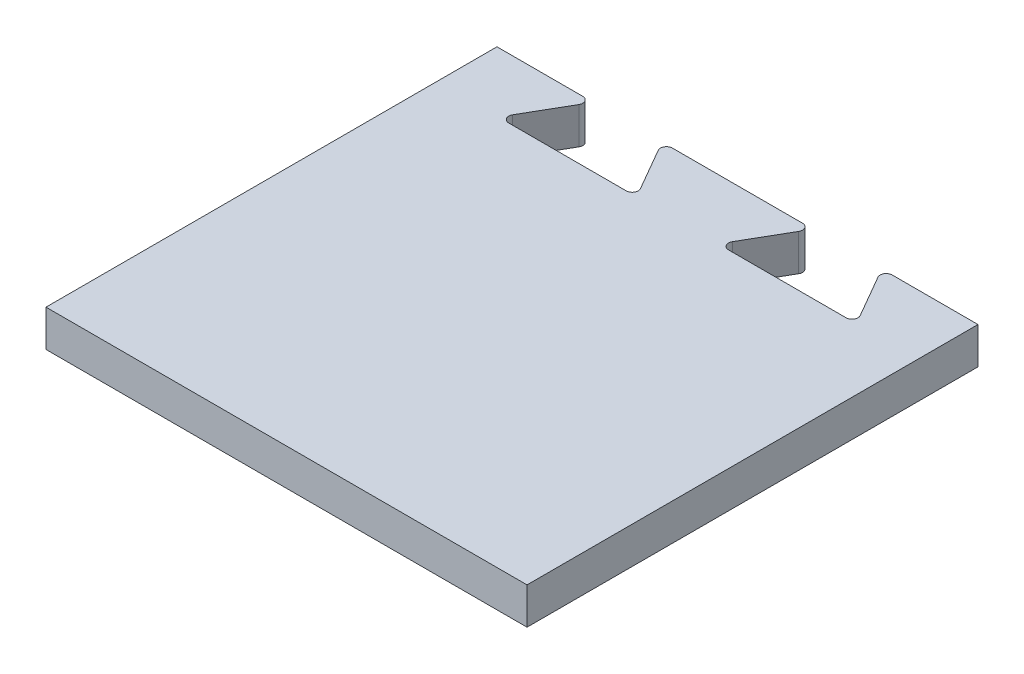
ISO-10303-21;
HEADER;
FILE_DESCRIPTION(('STEP AP214'),'2;1');
FILE_NAME('part.step','',(''),(''),'','','');
FILE_SCHEMA(('AUTOMOTIVE_DESIGN { 1 0 10303 214 1 1 1 1 }'));
ENDSEC;
DATA;
#1=APPLICATION_CONTEXT('core data for automotive mechanical design processes');
#2=APPLICATION_PROTOCOL_DEFINITION('international standard','automotive_design',2000,#1);
#3=PRODUCT_CONTEXT('',#1,'mechanical');
#4=PRODUCT('Part','Part','',(#3));
#5=PRODUCT_RELATED_PRODUCT_CATEGORY('part','',(#4));
#6=PRODUCT_DEFINITION_FORMATION('','',#4);
#7=PRODUCT_DEFINITION_CONTEXT('part definition',#1,'design');
#8=PRODUCT_DEFINITION('design','',#6,#7);
#9=PRODUCT_DEFINITION_SHAPE('','',#8);
#10=(LENGTH_UNIT() NAMED_UNIT(*) SI_UNIT(.MILLI.,.METRE.));
#11=(NAMED_UNIT(*) PLANE_ANGLE_UNIT() SI_UNIT($,.RADIAN.));
#12=(NAMED_UNIT(*) SI_UNIT($,.STERADIAN.) SOLID_ANGLE_UNIT());
#13=UNCERTAINTY_MEASURE_WITH_UNIT(LENGTH_MEASURE(1.E-05),#10,'distance_accuracy_value','');
#14=(GEOMETRIC_REPRESENTATION_CONTEXT(3) GLOBAL_UNCERTAINTY_ASSIGNED_CONTEXT((#13)) GLOBAL_UNIT_ASSIGNED_CONTEXT((#10,
#11,#12)) REPRESENTATION_CONTEXT('',''));
#15=CARTESIAN_POINT('',(0.,0.,0.));
#16=DIRECTION('',(0.,0.,1.));
#17=DIRECTION('',(1.,0.,0.));
#18=AXIS2_PLACEMENT_3D('',#15,#16,#17);
#19=CARTESIAN_POINT('',(40.,3.05,0.));
#20=DIRECTION('',(0.,0.,-1.));
#21=DIRECTION('',(-1.,0.,0.));
#22=AXIS2_PLACEMENT_3D('',#19,#20,#21);
#23=PLANE('',#22);
#24=DIRECTION('',(1.,0.,0.));
#25=VECTOR('',#24,1.);
#26=CARTESIAN_POINT('',(40.,0.,0.));
#27=LINE('',#26,#25);
#28=CARTESIAN_POINT('',(0.,0.,0.));
#29=VERTEX_POINT('',#28);
#30=CARTESIAN_POINT('',(40.,0.,0.));
#31=VERTEX_POINT('',#30);
#32=EDGE_CURVE('E207',#29,#31,#27,.T.);
#33=ORIENTED_EDGE('',*,*,#32,.T.);
#34=DIRECTION('',(0.,-1.,0.));
#35=VECTOR('',#34,1.);
#36=CARTESIAN_POINT('',(40.,3.05,0.));
#37=LINE('',#36,#35);
#38=CARTESIAN_POINT('',(40.,3.05,0.));
#39=VERTEX_POINT('',#38);
#40=EDGE_CURVE('E186',#39,#31,#37,.T.);
#41=ORIENTED_EDGE('',*,*,#40,.F.);
#42=DIRECTION('',(1.,0.,0.));
#43=VECTOR('',#42,1.);
#44=CARTESIAN_POINT('',(40.,3.05,0.));
#45=LINE('',#44,#43);
#46=CARTESIAN_POINT('',(0.,3.05,0.));
#47=VERTEX_POINT('',#46);
#48=EDGE_CURVE('E194',#47,#39,#45,.T.);
#49=ORIENTED_EDGE('',*,*,#48,.F.);
#50=DIRECTION('',(0.,-1.,0.));
#51=VECTOR('',#50,1.);
#52=CARTESIAN_POINT('',(0.,3.05,0.));
#53=LINE('',#52,#51);
#54=EDGE_CURVE('E347',#47,#29,#53,.T.);
#55=ORIENTED_EDGE('',*,*,#54,.T.);
#56=EDGE_LOOP('',(#33,#41,#49,#55));
#57=FACE_BOUND('',#56,.T.);
#58=ADVANCED_FACE('F43',(#57),#23,.F.);
#59=CARTESIAN_POINT('',(40.,3.05,-37.5));
#60=DIRECTION('',(-1.,0.,0.));
#61=DIRECTION('',(0.,0.,1.));
#62=AXIS2_PLACEMENT_3D('',#59,#60,#61);
#63=PLANE('',#62);
#64=DIRECTION('',(0.,0.,-1.));
#65=VECTOR('',#64,1.);
#66=CARTESIAN_POINT('',(40.,0.,-37.5));
#67=LINE('',#66,#65);
#68=CARTESIAN_POINT('',(40.,0.,-37.5));
#69=VERTEX_POINT('',#68);
#70=EDGE_CURVE('E350',#31,#69,#67,.T.);
#71=ORIENTED_EDGE('',*,*,#70,.T.);
#72=DIRECTION('',(0.,-1.,0.));
#73=VECTOR('',#72,1.);
#74=CARTESIAN_POINT('',(40.,3.05,-37.5));
#75=LINE('',#74,#73);
#76=CARTESIAN_POINT('',(40.,3.05,-37.5));
#77=VERTEX_POINT('',#76);
#78=EDGE_CURVE('E189',#77,#69,#75,.T.);
#79=ORIENTED_EDGE('',*,*,#78,.F.);
#80=DIRECTION('',(0.,0.,-1.));
#81=VECTOR('',#80,1.);
#82=CARTESIAN_POINT('',(40.,3.05,-37.5));
#83=LINE('',#82,#81);
#84=EDGE_CURVE('E182',#39,#77,#83,.T.);
#85=ORIENTED_EDGE('',*,*,#84,.F.);
#86=ORIENTED_EDGE('',*,*,#40,.T.);
#87=EDGE_LOOP('',(#71,#79,#85,#86));
#88=FACE_BOUND('',#87,.T.);
#89=ADVANCED_FACE('F184',(#88),#63,.F.);
#90=CARTESIAN_POINT('',(32.,3.05,-37.5));
#91=DIRECTION('',(0.,0.,1.));
#92=DIRECTION('',(1.,0.,0.));
#93=AXIS2_PLACEMENT_3D('',#90,#91,#92);
#94=PLANE('',#93);
#95=DIRECTION('',(-1.,0.,0.));
#96=VECTOR('',#95,1.);
#97=CARTESIAN_POINT('',(32.,0.,-37.5));
#98=LINE('',#97,#96);
#99=CARTESIAN_POINT('',(32.8660254037844,0.,-37.5));
#100=VERTEX_POINT('',#99);
#101=EDGE_CURVE('E353',#69,#100,#98,.T.);
#102=ORIENTED_EDGE('',*,*,#101,.T.);
#103=DIRECTION('',(0.,-1.,0.));
#104=VECTOR('',#103,1.);
#105=CARTESIAN_POINT('',(32.8660254037844,3.05,-37.5));
#106=LINE('',#105,#104);
#107=CARTESIAN_POINT('',(32.8660254037844,3.05,-37.5));
#108=VERTEX_POINT('',#107);
#109=EDGE_CURVE('E241',#100,#108,#106,.F.);
#110=ORIENTED_EDGE('',*,*,#109,.T.);
#111=DIRECTION('',(-1.,0.,0.));
#112=VECTOR('',#111,1.);
#113=CARTESIAN_POINT('',(32.,3.05,-37.5));
#114=LINE('',#113,#112);
#115=EDGE_CURVE('E193',#77,#108,#114,.T.);
#116=ORIENTED_EDGE('',*,*,#115,.F.);
#117=ORIENTED_EDGE('',*,*,#78,.T.);
#118=EDGE_LOOP('',(#102,#110,#116,#117));
#119=FACE_BOUND('',#118,.T.);
#120=ADVANCED_FACE('F394',(#119),#94,.F.);
#121=CARTESIAN_POINT('',(34.8867513459482,3.05,-32.5));
#122=DIRECTION('',(0.866025403784436,0.,-0.500000000000004));
#123=DIRECTION('',(-0.500000000000004,0.,-0.866025403784436));
#124=AXIS2_PLACEMENT_3D('',#121,#122,#123);
#125=PLANE('',#124);
#126=DIRECTION('',(0.500000000000004,0.,0.866025403784436));
#127=VECTOR('',#126,1.);
#128=CARTESIAN_POINT('',(34.8867513459482,0.,-32.5));
#129=LINE('',#128,#127);
#130=CARTESIAN_POINT('',(32.4330127018922,0.,-36.75));
#131=VERTEX_POINT('',#130);
#132=CARTESIAN_POINT('',(34.4537386440559,0.,-33.25));
#133=VERTEX_POINT('',#132);
#134=EDGE_CURVE('E357',#131,#133,#129,.T.);
#135=ORIENTED_EDGE('',*,*,#134,.T.);
#136=DIRECTION('',(0.,-1.,0.));
#137=VECTOR('',#136,1.);
#138=CARTESIAN_POINT('',(34.4537386440559,3.05,-33.25));
#139=LINE('',#138,#137);
#140=CARTESIAN_POINT('',(34.4537386440559,3.05,-33.25));
#141=VERTEX_POINT('',#140);
#142=EDGE_CURVE('E226',#133,#141,#139,.F.);
#143=ORIENTED_EDGE('',*,*,#142,.T.);
#144=DIRECTION('',(0.500000000000004,0.,0.866025403784436));
#145=VECTOR('',#144,1.);
#146=CARTESIAN_POINT('',(34.8867513459482,3.05,-32.5));
#147=LINE('',#146,#145);
#148=CARTESIAN_POINT('',(32.4330127018922,3.05,-36.75));
#149=VERTEX_POINT('',#148);
#150=EDGE_CURVE('E398',#149,#141,#147,.T.);
#151=ORIENTED_EDGE('',*,*,#150,.F.);
#152=DIRECTION('',(0.,-1.,0.));
#153=VECTOR('',#152,1.);
#154=CARTESIAN_POINT('',(32.4330127018922,3.05,-36.75));
#155=LINE('',#154,#153);
#156=EDGE_CURVE('E222',#149,#131,#155,.T.);
#157=ORIENTED_EDGE('',*,*,#156,.T.);
#158=EDGE_LOOP('',(#135,#143,#151,#157));
#159=FACE_BOUND('',#158,.T.);
#160=ADVANCED_FACE('F458',(#159),#125,.F.);
#161=CARTESIAN_POINT('',(23.3867513459482,3.05,-32.5));
#162=DIRECTION('',(0.,0.,1.));
#163=DIRECTION('',(1.,0.,0.));
#164=AXIS2_PLACEMENT_3D('',#161,#162,#163);
#165=PLANE('',#164);
#166=DIRECTION('',(-1.,0.,0.));
#167=VECTOR('',#166,1.);
#168=CARTESIAN_POINT('',(23.3867513459482,3.05,-32.5));
#169=LINE('',#168,#167);
#170=CARTESIAN_POINT('',(34.0207259421637,3.05,-32.5));
#171=VERTEX_POINT('',#170);
#172=CARTESIAN_POINT('',(24.2527767497326,3.05,-32.5));
#173=VERTEX_POINT('',#172);
#174=EDGE_CURVE('E402',#171,#173,#169,.T.);
#175=ORIENTED_EDGE('',*,*,#174,.F.);
#176=DIRECTION('',(0.,-1.,0.));
#177=VECTOR('',#176,1.);
#178=CARTESIAN_POINT('',(34.0207259421637,0.,-32.5));
#179=LINE('',#178,#177);
#180=CARTESIAN_POINT('',(34.0207259421637,0.,-32.5));
#181=VERTEX_POINT('',#180);
#182=EDGE_CURVE('E213',#171,#181,#179,.T.);
#183=ORIENTED_EDGE('',*,*,#182,.T.);
#184=DIRECTION('',(-1.,0.,0.));
#185=VECTOR('',#184,1.);
#186=CARTESIAN_POINT('',(23.3867513459482,0.,-32.5));
#187=LINE('',#186,#185);
#188=CARTESIAN_POINT('',(24.2527767497326,0.,-32.5));
#189=VERTEX_POINT('',#188);
#190=EDGE_CURVE('E361',#181,#189,#187,.T.);
#191=ORIENTED_EDGE('',*,*,#190,.T.);
#192=DIRECTION('',(0.,-1.,0.));
#193=VECTOR('',#192,1.);
#194=CARTESIAN_POINT('',(24.2527767497326,3.05,-32.5));
#195=LINE('',#194,#193);
#196=EDGE_CURVE('E209',#189,#173,#195,.F.);
#197=ORIENTED_EDGE('',*,*,#196,.T.);
#198=EDGE_LOOP('',(#175,#183,#191,#197));
#199=FACE_BOUND('',#198,.T.);
#200=ADVANCED_FACE('F451',(#199),#165,.F.);
#201=CARTESIAN_POINT('',(26.2735026918963,3.05,-37.5));
#202=DIRECTION('',(-0.866025403784437,0.,-0.500000000000003));
#203=DIRECTION('',(-0.500000000000003,0.,0.866025403784437));
#204=AXIS2_PLACEMENT_3D('',#201,#202,#203);
#205=PLANE('',#204);
#206=DIRECTION('',(0.500000000000003,0.,-0.866025403784437));
#207=VECTOR('',#206,1.);
#208=CARTESIAN_POINT('',(26.2735026918963,3.05,-37.5));
#209=LINE('',#208,#207);
#210=CARTESIAN_POINT('',(23.8197640478404,3.05,-33.25));
#211=VERTEX_POINT('',#210);
#212=CARTESIAN_POINT('',(25.8404899900041,3.05,-36.75));
#213=VERTEX_POINT('',#212);
#214=EDGE_CURVE('E408',#211,#213,#209,.T.);
#215=ORIENTED_EDGE('',*,*,#214,.F.);
#216=DIRECTION('',(0.,-1.,0.));
#217=VECTOR('',#216,1.);
#218=CARTESIAN_POINT('',(23.8197640478404,0.,-33.25));
#219=LINE('',#218,#217);
#220=CARTESIAN_POINT('',(23.8197640478404,0.,-33.25));
#221=VERTEX_POINT('',#220);
#222=EDGE_CURVE('E258',#211,#221,#219,.T.);
#223=ORIENTED_EDGE('',*,*,#222,.T.);
#224=DIRECTION('',(0.500000000000003,0.,-0.866025403784437));
#225=VECTOR('',#224,1.);
#226=CARTESIAN_POINT('',(26.2735026918963,0.,-37.5));
#227=LINE('',#226,#225);
#228=CARTESIAN_POINT('',(25.8404899900041,0.,-36.75));
#229=VERTEX_POINT('',#228);
#230=EDGE_CURVE('E365',#221,#229,#227,.T.);
#231=ORIENTED_EDGE('',*,*,#230,.T.);
#232=DIRECTION('',(0.,-1.,0.));
#233=VECTOR('',#232,1.);
#234=CARTESIAN_POINT('',(25.8404899900041,3.05,-36.75));
#235=LINE('',#234,#233);
#236=EDGE_CURVE('E255',#229,#213,#235,.F.);
#237=ORIENTED_EDGE('',*,*,#236,.T.);
#238=EDGE_LOOP('',(#215,#223,#231,#237));
#239=FACE_BOUND('',#238,.T.);
#240=ADVANCED_FACE('F442',(#239),#205,.F.);
#241=CARTESIAN_POINT('',(13.7264973081037,3.05,-37.5));
#242=DIRECTION('',(0.,0.,1.));
#243=DIRECTION('',(1.,0.,0.));
#244=AXIS2_PLACEMENT_3D('',#241,#242,#243);
#245=PLANE('',#244);
#246=DIRECTION('',(-1.,0.,0.));
#247=VECTOR('',#246,1.);
#248=CARTESIAN_POINT('',(13.7264973081037,3.05,-37.5));
#249=LINE('',#248,#247);
#250=CARTESIAN_POINT('',(25.4074772881119,3.05,-37.5));
#251=VERTEX_POINT('',#250);
#252=CARTESIAN_POINT('',(14.5925227118881,3.05,-37.5));
#253=VERTEX_POINT('',#252);
#254=EDGE_CURVE('E412',#251,#253,#249,.T.);
#255=ORIENTED_EDGE('',*,*,#254,.F.);
#256=DIRECTION('',(0.,-1.,0.));
#257=VECTOR('',#256,1.);
#258=CARTESIAN_POINT('',(25.4074772881119,3.05,-37.5));
#259=LINE('',#258,#257);
#260=CARTESIAN_POINT('',(25.4074772881119,0.,-37.5));
#261=VERTEX_POINT('',#260);
#262=EDGE_CURVE('E265',#251,#261,#259,.T.);
#263=ORIENTED_EDGE('',*,*,#262,.T.);
#264=DIRECTION('',(-1.,0.,0.));
#265=VECTOR('',#264,1.);
#266=CARTESIAN_POINT('',(13.7264973081037,0.,-37.5));
#267=LINE('',#266,#265);
#268=CARTESIAN_POINT('',(14.5925227118881,0.,-37.5));
#269=VERTEX_POINT('',#268);
#270=EDGE_CURVE('E369',#261,#269,#267,.T.);
#271=ORIENTED_EDGE('',*,*,#270,.T.);
#272=DIRECTION('',(0.,-1.,0.));
#273=VECTOR('',#272,1.);
#274=CARTESIAN_POINT('',(14.5925227118881,3.05,-37.5));
#275=LINE('',#274,#273);
#276=EDGE_CURVE('E262',#269,#253,#275,.F.);
#277=ORIENTED_EDGE('',*,*,#276,.T.);
#278=EDGE_LOOP('',(#255,#263,#271,#277));
#279=FACE_BOUND('',#278,.T.);
#280=ADVANCED_FACE('F433',(#279),#245,.F.);
#281=CARTESIAN_POINT('',(16.6132486540518,3.05,-32.5));
#282=DIRECTION('',(0.866025403784436,0.,-0.500000000000004));
#283=DIRECTION('',(-0.500000000000004,0.,-0.866025403784436));
#284=AXIS2_PLACEMENT_3D('',#281,#282,#283);
#285=PLANE('',#284);
#286=DIRECTION('',(0.500000000000004,0.,0.866025403784436));
#287=VECTOR('',#286,1.);
#288=CARTESIAN_POINT('',(16.6132486540518,3.05,-32.5));
#289=LINE('',#288,#287);
#290=CARTESIAN_POINT('',(14.1595100099959,3.05,-36.75));
#291=VERTEX_POINT('',#290);
#292=CARTESIAN_POINT('',(16.1802359521596,3.05,-33.25));
#293=VERTEX_POINT('',#292);
#294=EDGE_CURVE('E341',#291,#293,#289,.T.);
#295=ORIENTED_EDGE('',*,*,#294,.F.);
#296=DIRECTION('',(0.,-1.,0.));
#297=VECTOR('',#296,1.);
#298=CARTESIAN_POINT('',(14.1595100099959,3.05,-36.75));
#299=LINE('',#298,#297);
#300=CARTESIAN_POINT('',(14.1595100099959,0.,-36.75));
#301=VERTEX_POINT('',#300);
#302=EDGE_CURVE('E272',#291,#301,#299,.T.);
#303=ORIENTED_EDGE('',*,*,#302,.T.);
#304=DIRECTION('',(0.500000000000004,0.,0.866025403784436));
#305=VECTOR('',#304,1.);
#306=CARTESIAN_POINT('',(16.6132486540518,0.,-32.5));
#307=LINE('',#306,#305);
#308=CARTESIAN_POINT('',(16.1802359521596,0.,-33.25));
#309=VERTEX_POINT('',#308);
#310=EDGE_CURVE('E328',#301,#309,#307,.T.);
#311=ORIENTED_EDGE('',*,*,#310,.T.);
#312=DIRECTION('',(0.,-1.,0.));
#313=VECTOR('',#312,1.);
#314=CARTESIAN_POINT('',(16.1802359521596,3.05,-33.25));
#315=LINE('',#314,#313);
#316=EDGE_CURVE('E269',#309,#293,#315,.F.);
#317=ORIENTED_EDGE('',*,*,#316,.T.);
#318=EDGE_LOOP('',(#295,#303,#311,#317));
#319=FACE_BOUND('',#318,.T.);
#320=ADVANCED_FACE('F426',(#319),#285,.F.);
#321=CARTESIAN_POINT('',(5.11324865405185,3.05,-32.5));
#322=DIRECTION('',(0.,0.,1.));
#323=DIRECTION('',(1.,0.,0.));
#324=AXIS2_PLACEMENT_3D('',#321,#322,#323);
#325=PLANE('',#324);
#326=DIRECTION('',(-1.,0.,0.));
#327=VECTOR('',#326,1.);
#328=CARTESIAN_POINT('',(5.11324865405185,3.05,-32.5));
#329=LINE('',#328,#327);
#330=CARTESIAN_POINT('',(15.7472232502674,3.05,-32.5));
#331=VERTEX_POINT('',#330);
#332=CARTESIAN_POINT('',(5.97927405783629,3.05,-32.5));
#333=VERTEX_POINT('',#332);
#334=EDGE_CURVE('E333',#331,#333,#329,.T.);
#335=ORIENTED_EDGE('',*,*,#334,.F.);
#336=DIRECTION('',(0.,-1.,0.));
#337=VECTOR('',#336,1.);
#338=CARTESIAN_POINT('',(15.7472232502674,0.,-32.5));
#339=LINE('',#338,#337);
#340=CARTESIAN_POINT('',(15.7472232502674,0.,-32.5));
#341=VERTEX_POINT('',#340);
#342=EDGE_CURVE('E279',#331,#341,#339,.T.);
#343=ORIENTED_EDGE('',*,*,#342,.T.);
#344=DIRECTION('',(-1.,0.,0.));
#345=VECTOR('',#344,1.);
#346=CARTESIAN_POINT('',(5.11324865405185,0.,-32.5));
#347=LINE('',#346,#345);
#348=CARTESIAN_POINT('',(5.97927405783629,0.,-32.5));
#349=VERTEX_POINT('',#348);
#350=EDGE_CURVE('E317',#341,#349,#347,.T.);
#351=ORIENTED_EDGE('',*,*,#350,.T.);
#352=DIRECTION('',(0.,-1.,0.));
#353=VECTOR('',#352,1.);
#354=CARTESIAN_POINT('',(5.97927405783629,3.05,-32.5));
#355=LINE('',#354,#353);
#356=EDGE_CURVE('E276',#349,#333,#355,.F.);
#357=ORIENTED_EDGE('',*,*,#356,.T.);
#358=EDGE_LOOP('',(#335,#343,#351,#357));
#359=FACE_BOUND('',#358,.T.);
#360=ADVANCED_FACE('F324',(#359),#325,.F.);
#361=CARTESIAN_POINT('',(8.,3.05,-37.5));
#362=DIRECTION('',(-0.866025403784437,0.,-0.500000000000003));
#363=DIRECTION('',(-0.500000000000003,0.,0.866025403784437));
#364=AXIS2_PLACEMENT_3D('',#361,#362,#363);
#365=PLANE('',#364);
#366=DIRECTION('',(0.500000000000003,0.,-0.866025403784437));
#367=VECTOR('',#366,1.);
#368=CARTESIAN_POINT('',(8.,3.05,-37.5));
#369=LINE('',#368,#367);
#370=CARTESIAN_POINT('',(5.54626135594407,3.05,-33.25));
#371=VERTEX_POINT('',#370);
#372=CARTESIAN_POINT('',(7.56698729810778,3.05,-36.75));
#373=VERTEX_POINT('',#372);
#374=EDGE_CURVE('E332',#371,#373,#369,.T.);
#375=ORIENTED_EDGE('',*,*,#374,.F.);
#376=DIRECTION('',(0.,-1.,0.));
#377=VECTOR('',#376,1.);
#378=CARTESIAN_POINT('',(5.54626135594407,0.,-33.25));
#379=LINE('',#378,#377);
#380=CARTESIAN_POINT('',(5.54626135594407,0.,-33.25));
#381=VERTEX_POINT('',#380);
#382=EDGE_CURVE('E285',#371,#381,#379,.T.);
#383=ORIENTED_EDGE('',*,*,#382,.T.);
#384=DIRECTION('',(0.500000000000003,0.,-0.866025403784437));
#385=VECTOR('',#384,1.);
#386=CARTESIAN_POINT('',(8.,0.,-37.5));
#387=LINE('',#386,#385);
#388=CARTESIAN_POINT('',(7.56698729810778,0.,-36.75));
#389=VERTEX_POINT('',#388);
#390=EDGE_CURVE('E318',#381,#389,#387,.T.);
#391=ORIENTED_EDGE('',*,*,#390,.T.);
#392=DIRECTION('',(0.,-1.,0.));
#393=VECTOR('',#392,1.);
#394=CARTESIAN_POINT('',(7.56698729810778,3.05,-36.75));
#395=LINE('',#394,#393);
#396=EDGE_CURVE('E67',#389,#373,#395,.F.);
#397=ORIENTED_EDGE('',*,*,#396,.T.);
#398=EDGE_LOOP('',(#375,#383,#391,#397));
#399=FACE_BOUND('',#398,.T.);
#400=ADVANCED_FACE('F334',(#399),#365,.F.);
#401=CARTESIAN_POINT('',(0.,3.05,-37.5));
#402=DIRECTION('',(0.,0.,1.));
#403=DIRECTION('',(1.,0.,0.));
#404=AXIS2_PLACEMENT_3D('',#401,#402,#403);
#405=PLANE('',#404);
#406=DIRECTION('',(-1.,0.,0.));
#407=VECTOR('',#406,1.);
#408=CARTESIAN_POINT('',(0.,3.05,-37.5));
#409=LINE('',#408,#407);
#410=CARTESIAN_POINT('',(7.13397459621556,3.05,-37.5));
#411=VERTEX_POINT('',#410);
#412=CARTESIAN_POINT('',(0.,3.05,-37.5));
#413=VERTEX_POINT('',#412);
#414=EDGE_CURVE('E336',#411,#413,#409,.T.);
#415=ORIENTED_EDGE('',*,*,#414,.F.);
#416=DIRECTION('',(0.,-1.,0.));
#417=VECTOR('',#416,1.);
#418=CARTESIAN_POINT('',(7.13397459621556,3.05,-37.5));
#419=LINE('',#418,#417);
#420=CARTESIAN_POINT('',(7.13397459621556,0.,-37.5));
#421=VERTEX_POINT('',#420);
#422=EDGE_CURVE('E289',#411,#421,#419,.T.);
#423=ORIENTED_EDGE('',*,*,#422,.T.);
#424=DIRECTION('',(-1.,0.,0.));
#425=VECTOR('',#424,1.);
#426=CARTESIAN_POINT('',(0.,0.,-37.5));
#427=LINE('',#426,#425);
#428=CARTESIAN_POINT('',(0.,0.,-37.5));
#429=VERTEX_POINT('',#428);
#430=EDGE_CURVE('E378',#421,#429,#427,.T.);
#431=ORIENTED_EDGE('',*,*,#430,.T.);
#432=DIRECTION('',(0.,-1.,0.));
#433=VECTOR('',#432,1.);
#434=CARTESIAN_POINT('',(0.,3.05,-37.5));
#435=LINE('',#434,#433);
#436=EDGE_CURVE('E215',#413,#429,#435,.T.);
#437=ORIENTED_EDGE('',*,*,#436,.F.);
#438=EDGE_LOOP('',(#415,#423,#431,#437));
#439=FACE_BOUND('',#438,.T.);
#440=ADVANCED_FACE('F494',(#439),#405,.F.);
#441=CARTESIAN_POINT('',(0.,3.05,0.));
#442=DIRECTION('',(1.,0.,0.));
#443=DIRECTION('',(0.,0.,-1.));
#444=AXIS2_PLACEMENT_3D('',#441,#442,#443);
#445=PLANE('',#444);
#446=DIRECTION('',(0.,0.,1.));
#447=VECTOR('',#446,1.);
#448=CARTESIAN_POINT('',(0.,0.,0.));
#449=LINE('',#448,#447);
#450=EDGE_CURVE('E204',#429,#29,#449,.T.);
#451=ORIENTED_EDGE('',*,*,#450,.T.);
#452=ORIENTED_EDGE('',*,*,#54,.F.);
#453=DIRECTION('',(0.,0.,1.));
#454=VECTOR('',#453,1.);
#455=CARTESIAN_POINT('',(0.,3.05,0.));
#456=LINE('',#455,#454);
#457=EDGE_CURVE('E199',#413,#47,#456,.T.);
#458=ORIENTED_EDGE('',*,*,#457,.F.);
#459=ORIENTED_EDGE('',*,*,#436,.T.);
#460=EDGE_LOOP('',(#451,#452,#458,#459));
#461=FACE_BOUND('',#460,.T.);
#462=ADVANCED_FACE('F389',(#461),#445,.F.);
#463=CARTESIAN_POINT('',(0.,3.05,0.));
#464=DIRECTION('',(0.,-1.,0.));
#465=DIRECTION('',(0.,0.,-1.));
#466=AXIS2_PLACEMENT_3D('',#463,#464,#465);
#467=PLANE('',#466);
#468=ORIENTED_EDGE('',*,*,#115,.T.);
#469=CARTESIAN_POINT('',(32.8660254037844,3.05,-37.));
#470=DIRECTION('',(0.,-1.,0.));
#471=DIRECTION('',(0.,0.,-1.));
#472=AXIS2_PLACEMENT_3D('',#469,#470,#471);
#473=CIRCLE('',#472,0.5);
#474=EDGE_CURVE('E252',#108,#149,#473,.F.);
#475=ORIENTED_EDGE('',*,*,#474,.T.);
#476=ORIENTED_EDGE('',*,*,#150,.T.);
#477=CARTESIAN_POINT('',(34.0207259421637,3.05,-33.));
#478=DIRECTION('',(0.,-1.,0.));
#479=DIRECTION('',(0.,0.,-1.));
#480=AXIS2_PLACEMENT_3D('',#477,#478,#479);
#481=CIRCLE('',#480,0.5);
#482=EDGE_CURVE('E296',#141,#171,#481,.T.);
#483=ORIENTED_EDGE('',*,*,#482,.T.);
#484=ORIENTED_EDGE('',*,*,#174,.T.);
#485=CARTESIAN_POINT('',(24.2527767497326,3.05,-33.));
#486=DIRECTION('',(0.,-1.,0.));
#487=DIRECTION('',(0.,0.,-1.));
#488=AXIS2_PLACEMENT_3D('',#485,#486,#487);
#489=CIRCLE('',#488,0.5);
#490=EDGE_CURVE('E302',#173,#211,#489,.T.);
#491=ORIENTED_EDGE('',*,*,#490,.T.);
#492=ORIENTED_EDGE('',*,*,#214,.T.);
#493=CARTESIAN_POINT('',(25.4074772881119,3.05,-37.));
#494=DIRECTION('',(0.,-1.,0.));
#495=DIRECTION('',(0.,0.,-1.));
#496=AXIS2_PLACEMENT_3D('',#493,#494,#495);
#497=CIRCLE('',#496,0.5);
#498=EDGE_CURVE('E249',#213,#251,#497,.F.);
#499=ORIENTED_EDGE('',*,*,#498,.T.);
#500=ORIENTED_EDGE('',*,*,#254,.T.);
#501=CARTESIAN_POINT('',(14.5925227118881,3.05,-37.));
#502=DIRECTION('',(0.,-1.,0.));
#503=DIRECTION('',(0.,0.,-1.));
#504=AXIS2_PLACEMENT_3D('',#501,#502,#503);
#505=CIRCLE('',#504,0.5);
#506=EDGE_CURVE('E246',#253,#291,#505,.F.);
#507=ORIENTED_EDGE('',*,*,#506,.T.);
#508=ORIENTED_EDGE('',*,*,#294,.T.);
#509=CARTESIAN_POINT('',(15.7472232502674,3.05,-33.));
#510=DIRECTION('',(0.,-1.,0.));
#511=DIRECTION('',(0.,0.,-1.));
#512=AXIS2_PLACEMENT_3D('',#509,#510,#511);
#513=CIRCLE('',#512,0.5);
#514=EDGE_CURVE('E308',#293,#331,#513,.T.);
#515=ORIENTED_EDGE('',*,*,#514,.T.);
#516=ORIENTED_EDGE('',*,*,#334,.T.);
#517=CARTESIAN_POINT('',(5.97927405783629,3.05,-33.));
#518=DIRECTION('',(0.,-1.,0.));
#519=DIRECTION('',(0.,0.,-1.));
#520=AXIS2_PLACEMENT_3D('',#517,#518,#519);
#521=CIRCLE('',#520,0.5);
#522=EDGE_CURVE('E11',#333,#371,#521,.T.);
#523=ORIENTED_EDGE('',*,*,#522,.T.);
#524=ORIENTED_EDGE('',*,*,#374,.T.);
#525=CARTESIAN_POINT('',(7.13397459621556,3.05,-37.));
#526=DIRECTION('',(0.,-1.,0.));
#527=DIRECTION('',(0.,0.,-1.));
#528=AXIS2_PLACEMENT_3D('',#525,#526,#527);
#529=CIRCLE('',#528,0.5);
#530=EDGE_CURVE('E59',#373,#411,#529,.F.);
#531=ORIENTED_EDGE('',*,*,#530,.T.);
#532=ORIENTED_EDGE('',*,*,#414,.T.);
#533=ORIENTED_EDGE('',*,*,#457,.T.);
#534=ORIENTED_EDGE('',*,*,#48,.T.);
#535=ORIENTED_EDGE('',*,*,#84,.T.);
#536=EDGE_LOOP('',(#468,#475,#476,#483,#484,#491,#492,#499,#500,#507,#508,#515,#516,#523,#524,
#531,#532,#533,#534,#535));
#537=FACE_BOUND('',#536,.T.);
#538=ADVANCED_FACE('F197',(#537),#467,.F.);
#539=CARTESIAN_POINT('',(0.,0.,0.));
#540=DIRECTION('',(0.,-1.,0.));
#541=DIRECTION('',(0.,0.,-1.));
#542=AXIS2_PLACEMENT_3D('',#539,#540,#541);
#543=PLANE('',#542);
#544=ORIENTED_EDGE('',*,*,#134,.F.);
#545=CARTESIAN_POINT('',(32.8660254037844,0.,-37.));
#546=DIRECTION('',(0.,-1.,0.));
#547=DIRECTION('',(0.,0.,-1.));
#548=AXIS2_PLACEMENT_3D('',#545,#546,#547);
#549=CIRCLE('',#548,0.5);
#550=EDGE_CURVE('E238',#131,#100,#549,.T.);
#551=ORIENTED_EDGE('',*,*,#550,.T.);
#552=ORIENTED_EDGE('',*,*,#101,.F.);
#553=ORIENTED_EDGE('',*,*,#70,.F.);
#554=ORIENTED_EDGE('',*,*,#32,.F.);
#555=ORIENTED_EDGE('',*,*,#450,.F.);
#556=ORIENTED_EDGE('',*,*,#430,.F.);
#557=CARTESIAN_POINT('',(7.13397459621556,0.,-37.));
#558=DIRECTION('',(0.,-1.,0.));
#559=DIRECTION('',(0.,0.,-1.));
#560=AXIS2_PLACEMENT_3D('',#557,#558,#559);
#561=CIRCLE('',#560,0.5);
#562=EDGE_CURVE('E229',#421,#389,#561,.T.);
#563=ORIENTED_EDGE('',*,*,#562,.T.);
#564=ORIENTED_EDGE('',*,*,#390,.F.);
#565=CARTESIAN_POINT('',(5.97927405783629,0.,-33.));
#566=DIRECTION('',(0.,-1.,0.));
#567=DIRECTION('',(0.,0.,-1.));
#568=AXIS2_PLACEMENT_3D('',#565,#566,#567);
#569=CIRCLE('',#568,0.5);
#570=EDGE_CURVE('E52',#381,#349,#569,.F.);
#571=ORIENTED_EDGE('',*,*,#570,.T.);
#572=ORIENTED_EDGE('',*,*,#350,.F.);
#573=CARTESIAN_POINT('',(15.7472232502674,0.,-33.));
#574=DIRECTION('',(0.,-1.,0.));
#575=DIRECTION('',(0.,0.,-1.));
#576=AXIS2_PLACEMENT_3D('',#573,#574,#575);
#577=CIRCLE('',#576,0.5);
#578=EDGE_CURVE('E305',#341,#309,#577,.F.);
#579=ORIENTED_EDGE('',*,*,#578,.T.);
#580=ORIENTED_EDGE('',*,*,#310,.F.);
#581=CARTESIAN_POINT('',(14.5925227118881,0.,-37.));
#582=DIRECTION('',(0.,-1.,0.));
#583=DIRECTION('',(0.,0.,-1.));
#584=AXIS2_PLACEMENT_3D('',#581,#582,#583);
#585=CIRCLE('',#584,0.5);
#586=EDGE_CURVE('E232',#301,#269,#585,.T.);
#587=ORIENTED_EDGE('',*,*,#586,.T.);
#588=ORIENTED_EDGE('',*,*,#270,.F.);
#589=CARTESIAN_POINT('',(25.4074772881119,0.,-37.));
#590=DIRECTION('',(0.,-1.,0.));
#591=DIRECTION('',(0.,0.,-1.));
#592=AXIS2_PLACEMENT_3D('',#589,#590,#591);
#593=CIRCLE('',#592,0.5);
#594=EDGE_CURVE('E235',#261,#229,#593,.T.);
#595=ORIENTED_EDGE('',*,*,#594,.T.);
#596=ORIENTED_EDGE('',*,*,#230,.F.);
#597=CARTESIAN_POINT('',(24.2527767497326,0.,-33.));
#598=DIRECTION('',(0.,-1.,0.));
#599=DIRECTION('',(0.,0.,-1.));
#600=AXIS2_PLACEMENT_3D('',#597,#598,#599);
#601=CIRCLE('',#600,0.5);
#602=EDGE_CURVE('E299',#221,#189,#601,.F.);
#603=ORIENTED_EDGE('',*,*,#602,.T.);
#604=ORIENTED_EDGE('',*,*,#190,.F.);
#605=CARTESIAN_POINT('',(34.0207259421637,0.,-33.));
#606=DIRECTION('',(0.,-1.,0.));
#607=DIRECTION('',(0.,0.,-1.));
#608=AXIS2_PLACEMENT_3D('',#605,#606,#607);
#609=CIRCLE('',#608,0.5);
#610=EDGE_CURVE('E293',#181,#133,#609,.F.);
#611=ORIENTED_EDGE('',*,*,#610,.T.);
#612=EDGE_LOOP('',(#544,#551,#552,#553,#554,#555,#556,#563,#564,#571,#572,#579,#580,#587,#588,
#595,#596,#603,#604,#611));
#613=FACE_BOUND('',#612,.T.);
#614=ADVANCED_FACE('F316',(#613),#543,.T.);
#615=CARTESIAN_POINT('',(34.0207259421637,3.05,-33.));
#616=DIRECTION('',(0.,1.,0.));
#617=DIRECTION('',(0.,0.,1.));
#618=AXIS2_PLACEMENT_3D('',#615,#616,#617);
#619=CYLINDRICAL_SURFACE('',#618,0.5);
#620=ORIENTED_EDGE('',*,*,#482,.F.);
#621=ORIENTED_EDGE('',*,*,#142,.F.);
#622=ORIENTED_EDGE('',*,*,#610,.F.);
#623=ORIENTED_EDGE('',*,*,#182,.F.);
#624=EDGE_LOOP('',(#620,#621,#622,#623));
#625=FACE_BOUND('',#624,.T.);
#626=ADVANCED_FACE('F455',(#625),#619,.F.);
#627=CARTESIAN_POINT('',(32.8660254037844,3.05,-37.));
#628=DIRECTION('',(0.,-1.,0.));
#629=DIRECTION('',(0.,0.,-1.));
#630=AXIS2_PLACEMENT_3D('',#627,#628,#629);
#631=CYLINDRICAL_SURFACE('',#630,0.5);
#632=ORIENTED_EDGE('',*,*,#474,.F.);
#633=ORIENTED_EDGE('',*,*,#109,.F.);
#634=ORIENTED_EDGE('',*,*,#550,.F.);
#635=ORIENTED_EDGE('',*,*,#156,.F.);
#636=EDGE_LOOP('',(#632,#633,#634,#635));
#637=FACE_BOUND('',#636,.T.);
#638=ADVANCED_FACE('F462',(#637),#631,.T.);
#639=CARTESIAN_POINT('',(24.2527767497326,3.05,-33.));
#640=DIRECTION('',(0.,1.,0.));
#641=DIRECTION('',(0.,0.,1.));
#642=AXIS2_PLACEMENT_3D('',#639,#640,#641);
#643=CYLINDRICAL_SURFACE('',#642,0.5);
#644=ORIENTED_EDGE('',*,*,#490,.F.);
#645=ORIENTED_EDGE('',*,*,#196,.F.);
#646=ORIENTED_EDGE('',*,*,#602,.F.);
#647=ORIENTED_EDGE('',*,*,#222,.F.);
#648=EDGE_LOOP('',(#644,#645,#646,#647));
#649=FACE_BOUND('',#648,.T.);
#650=ADVANCED_FACE('F446',(#649),#643,.F.);
#651=CARTESIAN_POINT('',(25.4074772881119,3.05,-37.));
#652=DIRECTION('',(0.,-1.,0.));
#653=DIRECTION('',(0.,0.,-1.));
#654=AXIS2_PLACEMENT_3D('',#651,#652,#653);
#655=CYLINDRICAL_SURFACE('',#654,0.5);
#656=ORIENTED_EDGE('',*,*,#498,.F.);
#657=ORIENTED_EDGE('',*,*,#236,.F.);
#658=ORIENTED_EDGE('',*,*,#594,.F.);
#659=ORIENTED_EDGE('',*,*,#262,.F.);
#660=EDGE_LOOP('',(#656,#657,#658,#659));
#661=FACE_BOUND('',#660,.T.);
#662=ADVANCED_FACE('F437',(#661),#655,.T.);
#663=CARTESIAN_POINT('',(14.5925227118881,3.05,-37.));
#664=DIRECTION('',(0.,-1.,0.));
#665=DIRECTION('',(0.,0.,-1.));
#666=AXIS2_PLACEMENT_3D('',#663,#664,#665);
#667=CYLINDRICAL_SURFACE('',#666,0.5);
#668=ORIENTED_EDGE('',*,*,#506,.F.);
#669=ORIENTED_EDGE('',*,*,#276,.F.);
#670=ORIENTED_EDGE('',*,*,#586,.F.);
#671=ORIENTED_EDGE('',*,*,#302,.F.);
#672=EDGE_LOOP('',(#668,#669,#670,#671));
#673=FACE_BOUND('',#672,.T.);
#674=ADVANCED_FACE('F428',(#673),#667,.T.);
#675=CARTESIAN_POINT('',(15.7472232502674,3.05,-33.));
#676=DIRECTION('',(0.,1.,0.));
#677=DIRECTION('',(0.,0.,1.));
#678=AXIS2_PLACEMENT_3D('',#675,#676,#677);
#679=CYLINDRICAL_SURFACE('',#678,0.5);
#680=ORIENTED_EDGE('',*,*,#514,.F.);
#681=ORIENTED_EDGE('',*,*,#316,.F.);
#682=ORIENTED_EDGE('',*,*,#578,.F.);
#683=ORIENTED_EDGE('',*,*,#342,.F.);
#684=EDGE_LOOP('',(#680,#681,#682,#683));
#685=FACE_BOUND('',#684,.T.);
#686=ADVANCED_FACE('F424',(#685),#679,.F.);
#687=CARTESIAN_POINT('',(5.97927405783629,3.05,-33.));
#688=DIRECTION('',(0.,1.,0.));
#689=DIRECTION('',(0.,0.,1.));
#690=AXIS2_PLACEMENT_3D('',#687,#688,#689);
#691=CYLINDRICAL_SURFACE('',#690,0.5);
#692=ORIENTED_EDGE('',*,*,#522,.F.);
#693=ORIENTED_EDGE('',*,*,#356,.F.);
#694=ORIENTED_EDGE('',*,*,#570,.F.);
#695=ORIENTED_EDGE('',*,*,#382,.F.);
#696=EDGE_LOOP('',(#692,#693,#694,#695));
#697=FACE_BOUND('',#696,.T.);
#698=ADVANCED_FACE('F331',(#697),#691,.F.);
#699=CARTESIAN_POINT('',(7.13397459621556,3.05,-37.));
#700=DIRECTION('',(0.,-1.,0.));
#701=DIRECTION('',(0.,0.,-1.));
#702=AXIS2_PLACEMENT_3D('',#699,#700,#701);
#703=CYLINDRICAL_SURFACE('',#702,0.5);
#704=ORIENTED_EDGE('',*,*,#530,.F.);
#705=ORIENTED_EDGE('',*,*,#396,.F.);
#706=ORIENTED_EDGE('',*,*,#562,.F.);
#707=ORIENTED_EDGE('',*,*,#422,.F.);
#708=EDGE_LOOP('',(#704,#705,#706,#707));
#709=FACE_BOUND('',#708,.T.);
#710=ADVANCED_FACE('F45',(#709),#703,.T.);
#711=CLOSED_SHELL('',(#58,#89,#120,#160,#200,#240,#280,#320,#360,#400,#440,#462,#538,#614,#626,
#638,#650,#662,#674,#686,#698,#710));
#712=MANIFOLD_SOLID_BREP('B2',#711);
#713=ADVANCED_BREP_SHAPE_REPRESENTATION('',(#18,#712),#14);
#714=SHAPE_DEFINITION_REPRESENTATION(#9,#713);
ENDSEC;
END-ISO-10303-21;
